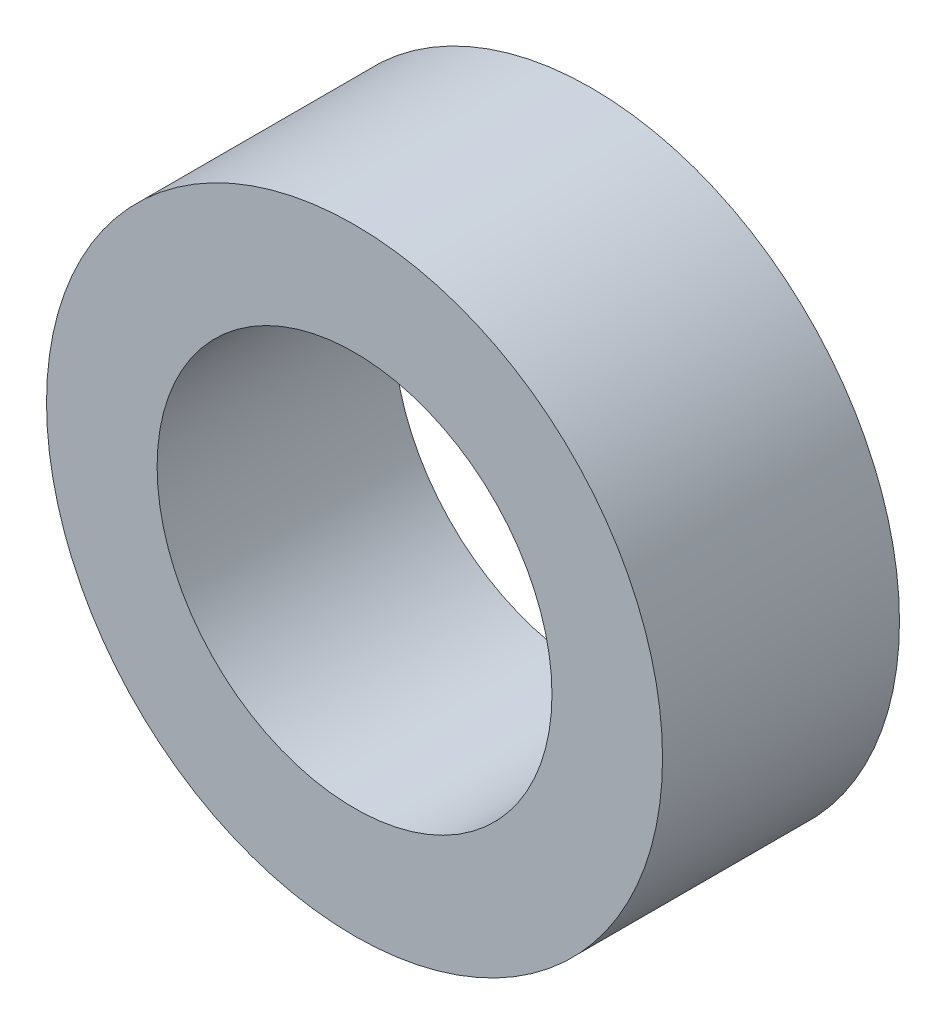
ISO-10303-21;
HEADER;
FILE_DESCRIPTION(('STEP AP214'),'2;1');
FILE_NAME('part.step','',(''),(''),'','','');
FILE_SCHEMA(('AUTOMOTIVE_DESIGN { 1 0 10303 214 1 1 1 1 }'));
ENDSEC;
DATA;
#1=APPLICATION_CONTEXT('core data for automotive mechanical design processes');
#2=APPLICATION_PROTOCOL_DEFINITION('international standard','automotive_design',2000,#1);
#3=PRODUCT_CONTEXT('',#1,'mechanical');
#4=PRODUCT('Part','Part','',(#3));
#5=PRODUCT_RELATED_PRODUCT_CATEGORY('part','',(#4));
#6=PRODUCT_DEFINITION_FORMATION('','',#4);
#7=PRODUCT_DEFINITION_CONTEXT('part definition',#1,'design');
#8=PRODUCT_DEFINITION('design','',#6,#7);
#9=PRODUCT_DEFINITION_SHAPE('','',#8);
#10=(LENGTH_UNIT() NAMED_UNIT(*) SI_UNIT(.MILLI.,.METRE.));
#11=(NAMED_UNIT(*) PLANE_ANGLE_UNIT() SI_UNIT($,.RADIAN.));
#12=(NAMED_UNIT(*) SI_UNIT($,.STERADIAN.) SOLID_ANGLE_UNIT());
#13=UNCERTAINTY_MEASURE_WITH_UNIT(LENGTH_MEASURE(1.E-05),#10,'distance_accuracy_value','');
#14=(GEOMETRIC_REPRESENTATION_CONTEXT(3) GLOBAL_UNCERTAINTY_ASSIGNED_CONTEXT((#13)) GLOBAL_UNIT_ASSIGNED_CONTEXT((#10,
#11,#12)) REPRESENTATION_CONTEXT('',''));
#15=CARTESIAN_POINT('',(0.,0.,0.));
#16=DIRECTION('',(0.,0.,1.));
#17=DIRECTION('',(1.,0.,0.));
#18=AXIS2_PLACEMENT_3D('',#15,#16,#17);
#19=CARTESIAN_POINT('',(0.,0.,3.));
#20=DIRECTION('',(0.,0.,1.));
#21=DIRECTION('',(1.,0.,0.));
#22=AXIS2_PLACEMENT_3D('',#19,#20,#21);
#23=PLANE('',#22);
#24=CARTESIAN_POINT('',(0.,0.,3.));
#25=DIRECTION('',(0.,0.,1.));
#26=DIRECTION('',(1.,0.,0.));
#27=AXIS2_PLACEMENT_3D('',#24,#25,#26);
#28=CIRCLE('',#27,3.9);
#29=CARTESIAN_POINT('',(3.9,0.,3.));
#30=VERTEX_POINT('',#29);
#31=EDGE_CURVE('E10',#30,#30,#28,.T.);
#32=ORIENTED_EDGE('',*,*,#31,.T.);
#33=EDGE_LOOP('',(#32));
#34=FACE_BOUND('',#33,.T.);
#35=CARTESIAN_POINT('',(0.,0.,3.));
#36=DIRECTION('',(0.,0.,1.));
#37=DIRECTION('',(1.,0.,0.));
#38=AXIS2_PLACEMENT_3D('',#35,#36,#37);
#39=CIRCLE('',#38,2.5);
#40=CARTESIAN_POINT('',(2.5,0.,3.));
#41=VERTEX_POINT('',#40);
#42=EDGE_CURVE('E46',#41,#41,#39,.T.);
#43=ORIENTED_EDGE('',*,*,#42,.F.);
#44=EDGE_LOOP('',(#43));
#45=FACE_BOUND('',#44,.T.);
#46=ADVANCED_FACE('F35',(#34,#45),#23,.T.);
#47=CARTESIAN_POINT('',(0.,0.,0.));
#48=DIRECTION('',(0.,0.,1.));
#49=DIRECTION('',(1.,0.,0.));
#50=AXIS2_PLACEMENT_3D('',#47,#48,#49);
#51=PLANE('',#50);
#52=CARTESIAN_POINT('',(0.,0.,0.));
#53=DIRECTION('',(0.,0.,1.));
#54=DIRECTION('',(1.,0.,0.));
#55=AXIS2_PLACEMENT_3D('',#52,#53,#54);
#56=CIRCLE('',#55,3.9);
#57=CARTESIAN_POINT('',(3.9,0.,0.));
#58=VERTEX_POINT('',#57);
#59=EDGE_CURVE('E39',#58,#58,#56,.T.);
#60=ORIENTED_EDGE('',*,*,#59,.F.);
#61=EDGE_LOOP('',(#60));
#62=FACE_BOUND('',#61,.T.);
#63=CARTESIAN_POINT('',(0.,0.,0.));
#64=DIRECTION('',(0.,0.,1.));
#65=DIRECTION('',(1.,0.,0.));
#66=AXIS2_PLACEMENT_3D('',#63,#64,#65);
#67=CIRCLE('',#66,2.5);
#68=CARTESIAN_POINT('',(2.5,0.,0.));
#69=VERTEX_POINT('',#68);
#70=EDGE_CURVE('E48',#69,#69,#67,.T.);
#71=ORIENTED_EDGE('',*,*,#70,.T.);
#72=EDGE_LOOP('',(#71));
#73=FACE_BOUND('',#72,.T.);
#74=ADVANCED_FACE('F58',(#62,#73),#51,.F.);
#75=CARTESIAN_POINT('',(0.,0.,3.));
#76=DIRECTION('',(0.,0.,-1.));
#77=DIRECTION('',(-1.,0.,0.));
#78=AXIS2_PLACEMENT_3D('',#75,#76,#77);
#79=CYLINDRICAL_SURFACE('',#78,3.9);
#80=ORIENTED_EDGE('',*,*,#31,.F.);
#81=EDGE_LOOP('',(#80));
#82=FACE_BOUND('',#81,.T.);
#83=ORIENTED_EDGE('',*,*,#59,.T.);
#84=EDGE_LOOP('',(#83));
#85=FACE_BOUND('',#84,.T.);
#86=ADVANCED_FACE('F37',(#82,#85),#79,.T.);
#87=CARTESIAN_POINT('',(0.,0.,3.));
#88=DIRECTION('',(0.,0.,-1.));
#89=DIRECTION('',(-1.,0.,0.));
#90=AXIS2_PLACEMENT_3D('',#87,#88,#89);
#91=CYLINDRICAL_SURFACE('',#90,2.5);
#92=ORIENTED_EDGE('',*,*,#42,.T.);
#93=EDGE_LOOP('',(#92));
#94=FACE_BOUND('',#93,.T.);
#95=ORIENTED_EDGE('',*,*,#70,.F.);
#96=EDGE_LOOP('',(#95));
#97=FACE_BOUND('',#96,.T.);
#98=ADVANCED_FACE('F54',(#94,#97),#91,.F.);
#99=CLOSED_SHELL('',(#46,#74,#86,#98));
#100=MANIFOLD_SOLID_BREP('B2',#99);
#101=ADVANCED_BREP_SHAPE_REPRESENTATION('',(#18,#100),#14);
#102=SHAPE_DEFINITION_REPRESENTATION(#9,#101);
ENDSEC;
END-ISO-10303-21;
